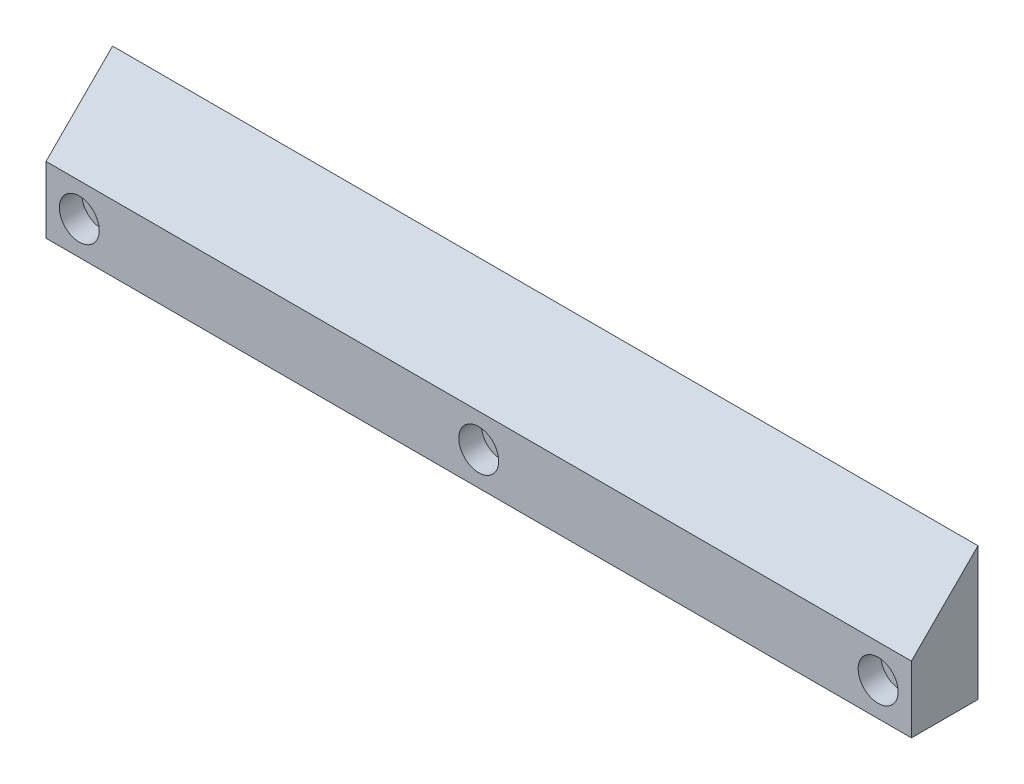
ISO-10303-21;
HEADER;
FILE_DESCRIPTION(('STEP AP214'),'2;1');
FILE_NAME('part.step','',(''),(''),'','','');
FILE_SCHEMA(('AUTOMOTIVE_DESIGN { 1 0 10303 214 1 1 1 1 }'));
ENDSEC;
DATA;
#1=APPLICATION_CONTEXT('core data for automotive mechanical design processes');
#2=APPLICATION_PROTOCOL_DEFINITION('international standard','automotive_design',2000,#1);
#3=PRODUCT_CONTEXT('',#1,'mechanical');
#4=PRODUCT('Part','Part','',(#3));
#5=PRODUCT_RELATED_PRODUCT_CATEGORY('part','',(#4));
#6=PRODUCT_DEFINITION_FORMATION('','',#4);
#7=PRODUCT_DEFINITION_CONTEXT('part definition',#1,'design');
#8=PRODUCT_DEFINITION('design','',#6,#7);
#9=PRODUCT_DEFINITION_SHAPE('','',#8);
#10=(LENGTH_UNIT() NAMED_UNIT(*) SI_UNIT(.MILLI.,.METRE.));
#11=(NAMED_UNIT(*) PLANE_ANGLE_UNIT() SI_UNIT($,.RADIAN.));
#12=(NAMED_UNIT(*) SI_UNIT($,.STERADIAN.) SOLID_ANGLE_UNIT());
#13=UNCERTAINTY_MEASURE_WITH_UNIT(LENGTH_MEASURE(1.E-05),#10,'distance_accuracy_value','');
#14=(GEOMETRIC_REPRESENTATION_CONTEXT(3) GLOBAL_UNCERTAINTY_ASSIGNED_CONTEXT((#13)) GLOBAL_UNIT_ASSIGNED_CONTEXT((#10,
#11,#12)) REPRESENTATION_CONTEXT('',''));
#15=CARTESIAN_POINT('',(0.,0.,0.));
#16=DIRECTION('',(0.,0.,1.));
#17=DIRECTION('',(1.,0.,0.));
#18=AXIS2_PLACEMENT_3D('',#15,#16,#17);
#19=CARTESIAN_POINT('',(65.,0.,10.));
#20=DIRECTION('',(-1.,0.,0.));
#21=DIRECTION('',(0.,0.,1.));
#22=AXIS2_PLACEMENT_3D('',#19,#20,#21);
#23=PLANE('',#22);
#24=DIRECTION('',(0.,1.,0.));
#25=VECTOR('',#24,1.);
#26=CARTESIAN_POINT('',(65.,0.,0.));
#27=LINE('',#26,#25);
#28=CARTESIAN_POINT('',(65.,0.,0.));
#29=VERTEX_POINT('',#28);
#30=CARTESIAN_POINT('',(65.,19.9999999999999,0.));
#31=VERTEX_POINT('',#30);
#32=EDGE_CURVE('E82',#29,#31,#27,.T.);
#33=ORIENTED_EDGE('',*,*,#32,.T.);
#34=DIRECTION('',(0.,-0.707106781186544,0.707106781186552));
#35=VECTOR('',#34,1.);
#36=CARTESIAN_POINT('',(65.,19.9999999999999,0.));
#37=LINE('',#36,#35);
#38=CARTESIAN_POINT('',(65.,10.,10.));
#39=VERTEX_POINT('',#38);
#40=EDGE_CURVE('E109',#31,#39,#37,.T.);
#41=ORIENTED_EDGE('',*,*,#40,.T.);
#42=DIRECTION('',(0.,1.,0.));
#43=VECTOR('',#42,1.);
#44=CARTESIAN_POINT('',(65.,0.,10.));
#45=LINE('',#44,#43);
#46=CARTESIAN_POINT('',(65.,0.,10.));
#47=VERTEX_POINT('',#46);
#48=EDGE_CURVE('E93',#47,#39,#45,.T.);
#49=ORIENTED_EDGE('',*,*,#48,.F.);
#50=DIRECTION('',(0.,0.,-1.));
#51=VECTOR('',#50,1.);
#52=CARTESIAN_POINT('',(65.,0.,10.));
#53=LINE('',#52,#51);
#54=EDGE_CURVE('E52',#47,#29,#53,.T.);
#55=ORIENTED_EDGE('',*,*,#54,.T.);
#56=EDGE_LOOP('',(#33,#41,#49,#55));
#57=FACE_BOUND('',#56,.T.);
#58=ADVANCED_FACE('F43',(#57),#23,.F.);
#59=CARTESIAN_POINT('',(-65.,0.,10.));
#60=DIRECTION('',(1.,0.,0.));
#61=DIRECTION('',(0.,0.,-1.));
#62=AXIS2_PLACEMENT_3D('',#59,#60,#61);
#63=PLANE('',#62);
#64=DIRECTION('',(0.,-1.,0.));
#65=VECTOR('',#64,1.);
#66=CARTESIAN_POINT('',(-65.,0.,0.));
#67=LINE('',#66,#65);
#68=CARTESIAN_POINT('',(-65.,19.9999999999999,0.));
#69=VERTEX_POINT('',#68);
#70=CARTESIAN_POINT('',(-65.,0.,0.));
#71=VERTEX_POINT('',#70);
#72=EDGE_CURVE('E72',#69,#71,#67,.T.);
#73=ORIENTED_EDGE('',*,*,#72,.T.);
#74=DIRECTION('',(0.,0.,-1.));
#75=VECTOR('',#74,1.);
#76=CARTESIAN_POINT('',(-65.,0.,10.));
#77=LINE('',#76,#75);
#78=CARTESIAN_POINT('',(-65.,0.,10.));
#79=VERTEX_POINT('',#78);
#80=EDGE_CURVE('E11',#79,#71,#77,.T.);
#81=ORIENTED_EDGE('',*,*,#80,.F.);
#82=DIRECTION('',(0.,-1.,0.));
#83=VECTOR('',#82,1.);
#84=CARTESIAN_POINT('',(-65.,0.,10.));
#85=LINE('',#84,#83);
#86=CARTESIAN_POINT('',(-65.,10.,10.));
#87=VERTEX_POINT('',#86);
#88=EDGE_CURVE('E91',#87,#79,#85,.T.);
#89=ORIENTED_EDGE('',*,*,#88,.F.);
#90=DIRECTION('',(0.,0.707106781186544,-0.707106781186552));
#91=VECTOR('',#90,1.);
#92=CARTESIAN_POINT('',(-65.,19.9999999999999,0.));
#93=LINE('',#92,#91);
#94=EDGE_CURVE('E99',#87,#69,#93,.T.);
#95=ORIENTED_EDGE('',*,*,#94,.T.);
#96=EDGE_LOOP('',(#73,#81,#89,#95));
#97=FACE_BOUND('',#96,.T.);
#98=ADVANCED_FACE('F98',(#97),#63,.F.);
#99=CARTESIAN_POINT('',(-65.,0.,10.));
#100=DIRECTION('',(0.,1.,0.));
#101=DIRECTION('',(-1.,0.,0.));
#102=AXIS2_PLACEMENT_3D('',#99,#100,#101);
#103=PLANE('',#102);
#104=DIRECTION('',(1.,0.,0.));
#105=VECTOR('',#104,1.);
#106=CARTESIAN_POINT('',(-65.,0.,0.));
#107=LINE('',#106,#105);
#108=EDGE_CURVE('E162',#71,#29,#107,.T.);
#109=ORIENTED_EDGE('',*,*,#108,.T.);
#110=ORIENTED_EDGE('',*,*,#54,.F.);
#111=DIRECTION('',(1.,0.,0.));
#112=VECTOR('',#111,1.);
#113=CARTESIAN_POINT('',(-65.,0.,10.));
#114=LINE('',#113,#112);
#115=EDGE_CURVE('E60',#79,#47,#114,.T.);
#116=ORIENTED_EDGE('',*,*,#115,.F.);
#117=ORIENTED_EDGE('',*,*,#80,.T.);
#118=EDGE_LOOP('',(#109,#110,#116,#117));
#119=FACE_BOUND('',#118,.T.);
#120=ADVANCED_FACE('F176',(#119),#103,.F.);
#121=CARTESIAN_POINT('',(0.,0.,10.));
#122=DIRECTION('',(0.,0.,-1.));
#123=DIRECTION('',(-1.,0.,0.));
#124=AXIS2_PLACEMENT_3D('',#121,#122,#123);
#125=PLANE('',#124);
#126=CARTESIAN_POINT('',(-60.,5.,10.));
#127=DIRECTION('',(0.,0.,1.));
#128=DIRECTION('',(1.,0.,0.));
#129=AXIS2_PLACEMENT_3D('',#126,#127,#128);
#130=CIRCLE('',#129,3.);
#131=CARTESIAN_POINT('',(-57.,5.,10.));
#132=VERTEX_POINT('',#131);
#133=EDGE_CURVE('E113',#132,#132,#130,.T.);
#134=ORIENTED_EDGE('',*,*,#133,.F.);
#135=EDGE_LOOP('',(#134));
#136=FACE_BOUND('',#135,.T.);
#137=CARTESIAN_POINT('',(0.,5.,10.));
#138=DIRECTION('',(0.,0.,1.));
#139=DIRECTION('',(1.,0.,0.));
#140=AXIS2_PLACEMENT_3D('',#137,#138,#139);
#141=CIRCLE('',#140,3.);
#142=CARTESIAN_POINT('',(3.,5.,10.));
#143=VERTEX_POINT('',#142);
#144=EDGE_CURVE('E129',#143,#143,#141,.T.);
#145=ORIENTED_EDGE('',*,*,#144,.F.);
#146=EDGE_LOOP('',(#145));
#147=FACE_BOUND('',#146,.T.);
#148=CARTESIAN_POINT('',(60.,5.,10.));
#149=DIRECTION('',(0.,0.,1.));
#150=DIRECTION('',(1.,0.,0.));
#151=AXIS2_PLACEMENT_3D('',#148,#149,#150);
#152=CIRCLE('',#151,3.);
#153=CARTESIAN_POINT('',(63.,5.,10.));
#154=VERTEX_POINT('',#153);
#155=EDGE_CURVE('E145',#154,#154,#152,.T.);
#156=ORIENTED_EDGE('',*,*,#155,.F.);
#157=EDGE_LOOP('',(#156));
#158=FACE_BOUND('',#157,.T.);
#159=ORIENTED_EDGE('',*,*,#48,.T.);
#160=DIRECTION('',(-1.,0.,0.));
#161=VECTOR('',#160,1.);
#162=CARTESIAN_POINT('',(-65.,10.,10.));
#163=LINE('',#162,#161);
#164=EDGE_CURVE('E88',#39,#87,#163,.T.);
#165=ORIENTED_EDGE('',*,*,#164,.T.);
#166=ORIENTED_EDGE('',*,*,#88,.T.);
#167=ORIENTED_EDGE('',*,*,#115,.T.);
#168=EDGE_LOOP('',(#159,#165,#166,#167));
#169=FACE_BOUND('',#168,.T.);
#170=ADVANCED_FACE('F90',(#136,#147,#158,#169),#125,.F.);
#171=CARTESIAN_POINT('',(0.,0.,0.));
#172=DIRECTION('',(0.,0.,-1.));
#173=DIRECTION('',(-1.,0.,0.));
#174=AXIS2_PLACEMENT_3D('',#171,#172,#173);
#175=PLANE('',#174);
#176=CARTESIAN_POINT('',(-60.,5.,0.));
#177=DIRECTION('',(0.,0.,1.));
#178=DIRECTION('',(1.,0.,0.));
#179=AXIS2_PLACEMENT_3D('',#176,#177,#178);
#180=CIRCLE('',#179,1.6);
#181=CARTESIAN_POINT('',(-58.4,5.,0.));
#182=VERTEX_POINT('',#181);
#183=EDGE_CURVE('E125',#182,#182,#180,.T.);
#184=ORIENTED_EDGE('',*,*,#183,.T.);
#185=EDGE_LOOP('',(#184));
#186=FACE_BOUND('',#185,.T.);
#187=CARTESIAN_POINT('',(0.,5.,0.));
#188=DIRECTION('',(0.,0.,1.));
#189=DIRECTION('',(1.,0.,0.));
#190=AXIS2_PLACEMENT_3D('',#187,#188,#189);
#191=CIRCLE('',#190,1.6);
#192=CARTESIAN_POINT('',(1.6,5.,0.));
#193=VERTEX_POINT('',#192);
#194=EDGE_CURVE('E141',#193,#193,#191,.T.);
#195=ORIENTED_EDGE('',*,*,#194,.T.);
#196=EDGE_LOOP('',(#195));
#197=FACE_BOUND('',#196,.T.);
#198=CARTESIAN_POINT('',(60.,5.,0.));
#199=DIRECTION('',(0.,0.,1.));
#200=DIRECTION('',(1.,0.,0.));
#201=AXIS2_PLACEMENT_3D('',#198,#199,#200);
#202=CIRCLE('',#201,1.6);
#203=CARTESIAN_POINT('',(61.6,5.,0.));
#204=VERTEX_POINT('',#203);
#205=EDGE_CURVE('E157',#204,#204,#202,.T.);
#206=ORIENTED_EDGE('',*,*,#205,.T.);
#207=EDGE_LOOP('',(#206));
#208=FACE_BOUND('',#207,.T.);
#209=ORIENTED_EDGE('',*,*,#32,.F.);
#210=ORIENTED_EDGE('',*,*,#108,.F.);
#211=ORIENTED_EDGE('',*,*,#72,.F.);
#212=DIRECTION('',(-1.,0.,0.));
#213=VECTOR('',#212,1.);
#214=CARTESIAN_POINT('',(79.1421356237309,19.9999999999999,0.));
#215=LINE('',#214,#213);
#216=EDGE_CURVE('E105',#31,#69,#215,.T.);
#217=ORIENTED_EDGE('',*,*,#216,.F.);
#218=EDGE_LOOP('',(#209,#210,#211,#217));
#219=FACE_BOUND('',#218,.T.);
#220=ADVANCED_FACE('F175',(#186,#197,#208,#219),#175,.T.);
#221=CARTESIAN_POINT('',(60.,5.,10.));
#222=DIRECTION('',(0.,0.,1.));
#223=DIRECTION('',(1.,0.,0.));
#224=AXIS2_PLACEMENT_3D('',#221,#222,#223);
#225=CYLINDRICAL_SURFACE('',#224,1.6);
#226=ORIENTED_EDGE('',*,*,#205,.F.);
#227=EDGE_LOOP('',(#226));
#228=FACE_BOUND('',#227,.T.);
#229=CARTESIAN_POINT('',(60.,5.,6.6));
#230=DIRECTION('',(0.,0.,1.));
#231=DIRECTION('',(1.,0.,0.));
#232=AXIS2_PLACEMENT_3D('',#229,#230,#231);
#233=CIRCLE('',#232,1.6);
#234=CARTESIAN_POINT('',(61.6,5.,6.6));
#235=VERTEX_POINT('',#234);
#236=EDGE_CURVE('E153',#235,#235,#233,.T.);
#237=ORIENTED_EDGE('',*,*,#236,.T.);
#238=EDGE_LOOP('',(#237));
#239=FACE_BOUND('',#238,.T.);
#240=ADVANCED_FACE('F213',(#228,#239),#225,.F.);
#241=CARTESIAN_POINT('',(61.6,5.,6.6));
#242=DIRECTION('',(0.,0.,-1.));
#243=DIRECTION('',(-1.,0.,0.));
#244=AXIS2_PLACEMENT_3D('',#241,#242,#243);
#245=PLANE('',#244);
#246=ORIENTED_EDGE('',*,*,#236,.F.);
#247=EDGE_LOOP('',(#246));
#248=FACE_BOUND('',#247,.T.);
#249=CARTESIAN_POINT('',(60.,5.,6.6));
#250=DIRECTION('',(0.,0.,1.));
#251=DIRECTION('',(1.,0.,0.));
#252=AXIS2_PLACEMENT_3D('',#249,#250,#251);
#253=CIRCLE('',#252,3.);
#254=CARTESIAN_POINT('',(63.,5.,6.6));
#255=VERTEX_POINT('',#254);
#256=EDGE_CURVE('E149',#255,#255,#253,.T.);
#257=ORIENTED_EDGE('',*,*,#256,.T.);
#258=EDGE_LOOP('',(#257));
#259=FACE_BOUND('',#258,.T.);
#260=ADVANCED_FACE('F279',(#248,#259),#245,.F.);
#261=CARTESIAN_POINT('',(60.,5.,10.));
#262=DIRECTION('',(0.,0.,1.));
#263=DIRECTION('',(1.,0.,0.));
#264=AXIS2_PLACEMENT_3D('',#261,#262,#263);
#265=CYLINDRICAL_SURFACE('',#264,3.);
#266=ORIENTED_EDGE('',*,*,#256,.F.);
#267=EDGE_LOOP('',(#266));
#268=FACE_BOUND('',#267,.T.);
#269=ORIENTED_EDGE('',*,*,#155,.T.);
#270=EDGE_LOOP('',(#269));
#271=FACE_BOUND('',#270,.T.);
#272=ADVANCED_FACE('F271',(#268,#271),#265,.F.);
#273=CARTESIAN_POINT('',(0.,5.,10.));
#274=DIRECTION('',(0.,0.,1.));
#275=DIRECTION('',(1.,0.,0.));
#276=AXIS2_PLACEMENT_3D('',#273,#274,#275);
#277=CYLINDRICAL_SURFACE('',#276,1.6);
#278=ORIENTED_EDGE('',*,*,#194,.F.);
#279=EDGE_LOOP('',(#278));
#280=FACE_BOUND('',#279,.T.);
#281=CARTESIAN_POINT('',(0.,5.,6.6));
#282=DIRECTION('',(0.,0.,1.));
#283=DIRECTION('',(1.,0.,0.));
#284=AXIS2_PLACEMENT_3D('',#281,#282,#283);
#285=CIRCLE('',#284,1.6);
#286=CARTESIAN_POINT('',(1.6,5.,6.6));
#287=VERTEX_POINT('',#286);
#288=EDGE_CURVE('E137',#287,#287,#285,.T.);
#289=ORIENTED_EDGE('',*,*,#288,.T.);
#290=EDGE_LOOP('',(#289));
#291=FACE_BOUND('',#290,.T.);
#292=ADVANCED_FACE('F263',(#280,#291),#277,.F.);
#293=CARTESIAN_POINT('',(1.6,5.,6.6));
#294=DIRECTION('',(0.,0.,-1.));
#295=DIRECTION('',(-1.,0.,0.));
#296=AXIS2_PLACEMENT_3D('',#293,#294,#295);
#297=PLANE('',#296);
#298=ORIENTED_EDGE('',*,*,#288,.F.);
#299=EDGE_LOOP('',(#298));
#300=FACE_BOUND('',#299,.T.);
#301=CARTESIAN_POINT('',(0.,5.,6.6));
#302=DIRECTION('',(0.,0.,1.));
#303=DIRECTION('',(1.,0.,0.));
#304=AXIS2_PLACEMENT_3D('',#301,#302,#303);
#305=CIRCLE('',#304,3.);
#306=CARTESIAN_POINT('',(3.,5.,6.6));
#307=VERTEX_POINT('',#306);
#308=EDGE_CURVE('E133',#307,#307,#305,.T.);
#309=ORIENTED_EDGE('',*,*,#308,.T.);
#310=EDGE_LOOP('',(#309));
#311=FACE_BOUND('',#310,.T.);
#312=ADVANCED_FACE('F255',(#300,#311),#297,.F.);
#313=CARTESIAN_POINT('',(0.,5.,10.));
#314=DIRECTION('',(0.,0.,1.));
#315=DIRECTION('',(1.,0.,0.));
#316=AXIS2_PLACEMENT_3D('',#313,#314,#315);
#317=CYLINDRICAL_SURFACE('',#316,3.);
#318=ORIENTED_EDGE('',*,*,#308,.F.);
#319=EDGE_LOOP('',(#318));
#320=FACE_BOUND('',#319,.T.);
#321=ORIENTED_EDGE('',*,*,#144,.T.);
#322=EDGE_LOOP('',(#321));
#323=FACE_BOUND('',#322,.T.);
#324=ADVANCED_FACE('F247',(#320,#323),#317,.F.);
#325=CARTESIAN_POINT('',(-60.,5.,10.));
#326=DIRECTION('',(0.,0.,1.));
#327=DIRECTION('',(1.,0.,0.));
#328=AXIS2_PLACEMENT_3D('',#325,#326,#327);
#329=CYLINDRICAL_SURFACE('',#328,1.6);
#330=ORIENTED_EDGE('',*,*,#183,.F.);
#331=EDGE_LOOP('',(#330));
#332=FACE_BOUND('',#331,.T.);
#333=CARTESIAN_POINT('',(-60.,5.,6.6));
#334=DIRECTION('',(0.,0.,1.));
#335=DIRECTION('',(1.,0.,0.));
#336=AXIS2_PLACEMENT_3D('',#333,#334,#335);
#337=CIRCLE('',#336,1.6);
#338=CARTESIAN_POINT('',(-58.4,5.,6.6));
#339=VERTEX_POINT('',#338);
#340=EDGE_CURVE('E121',#339,#339,#337,.T.);
#341=ORIENTED_EDGE('',*,*,#340,.T.);
#342=EDGE_LOOP('',(#341));
#343=FACE_BOUND('',#342,.T.);
#344=ADVANCED_FACE('F239',(#332,#343),#329,.F.);
#345=CARTESIAN_POINT('',(-58.4,5.,6.6));
#346=DIRECTION('',(0.,0.,-1.));
#347=DIRECTION('',(-1.,0.,0.));
#348=AXIS2_PLACEMENT_3D('',#345,#346,#347);
#349=PLANE('',#348);
#350=ORIENTED_EDGE('',*,*,#340,.F.);
#351=EDGE_LOOP('',(#350));
#352=FACE_BOUND('',#351,.T.);
#353=CARTESIAN_POINT('',(-60.,5.,6.6));
#354=DIRECTION('',(0.,0.,1.));
#355=DIRECTION('',(1.,0.,0.));
#356=AXIS2_PLACEMENT_3D('',#353,#354,#355);
#357=CIRCLE('',#356,3.);
#358=CARTESIAN_POINT('',(-57.,5.,6.6));
#359=VERTEX_POINT('',#358);
#360=EDGE_CURVE('E117',#359,#359,#357,.T.);
#361=ORIENTED_EDGE('',*,*,#360,.T.);
#362=EDGE_LOOP('',(#361));
#363=FACE_BOUND('',#362,.T.);
#364=ADVANCED_FACE('F231',(#352,#363),#349,.F.);
#365=CARTESIAN_POINT('',(-60.,5.,10.));
#366=DIRECTION('',(0.,0.,1.));
#367=DIRECTION('',(1.,0.,0.));
#368=AXIS2_PLACEMENT_3D('',#365,#366,#367);
#369=CYLINDRICAL_SURFACE('',#368,3.);
#370=ORIENTED_EDGE('',*,*,#360,.F.);
#371=EDGE_LOOP('',(#370));
#372=FACE_BOUND('',#371,.T.);
#373=ORIENTED_EDGE('',*,*,#133,.T.);
#374=EDGE_LOOP('',(#373));
#375=FACE_BOUND('',#374,.T.);
#376=ADVANCED_FACE('F222',(#372,#375),#369,.F.);
#377=CARTESIAN_POINT('',(79.1421356237309,19.9999999999999,0.));
#378=DIRECTION('',(0.,0.707106781186552,0.707106781186544));
#379=DIRECTION('',(0.,-0.707106781186544,0.707106781186552));
#380=AXIS2_PLACEMENT_3D('',#377,#378,#379);
#381=PLANE('',#380);
#382=ORIENTED_EDGE('',*,*,#40,.F.);
#383=ORIENTED_EDGE('',*,*,#216,.T.);
#384=ORIENTED_EDGE('',*,*,#94,.F.);
#385=ORIENTED_EDGE('',*,*,#164,.F.);
#386=EDGE_LOOP('',(#382,#383,#384,#385));
#387=FACE_BOUND('',#386,.T.);
#388=ADVANCED_FACE('F103',(#387),#381,.T.);
#389=CLOSED_SHELL('',(#58,#98,#120,#170,#220,#240,#260,#272,#292,#312,#324,#344,#364,#376,#388));
#390=MANIFOLD_SOLID_BREP('B2',#389);
#391=ADVANCED_BREP_SHAPE_REPRESENTATION('',(#18,#390),#14);
#392=SHAPE_DEFINITION_REPRESENTATION(#9,#391);
ENDSEC;
END-ISO-10303-21;
